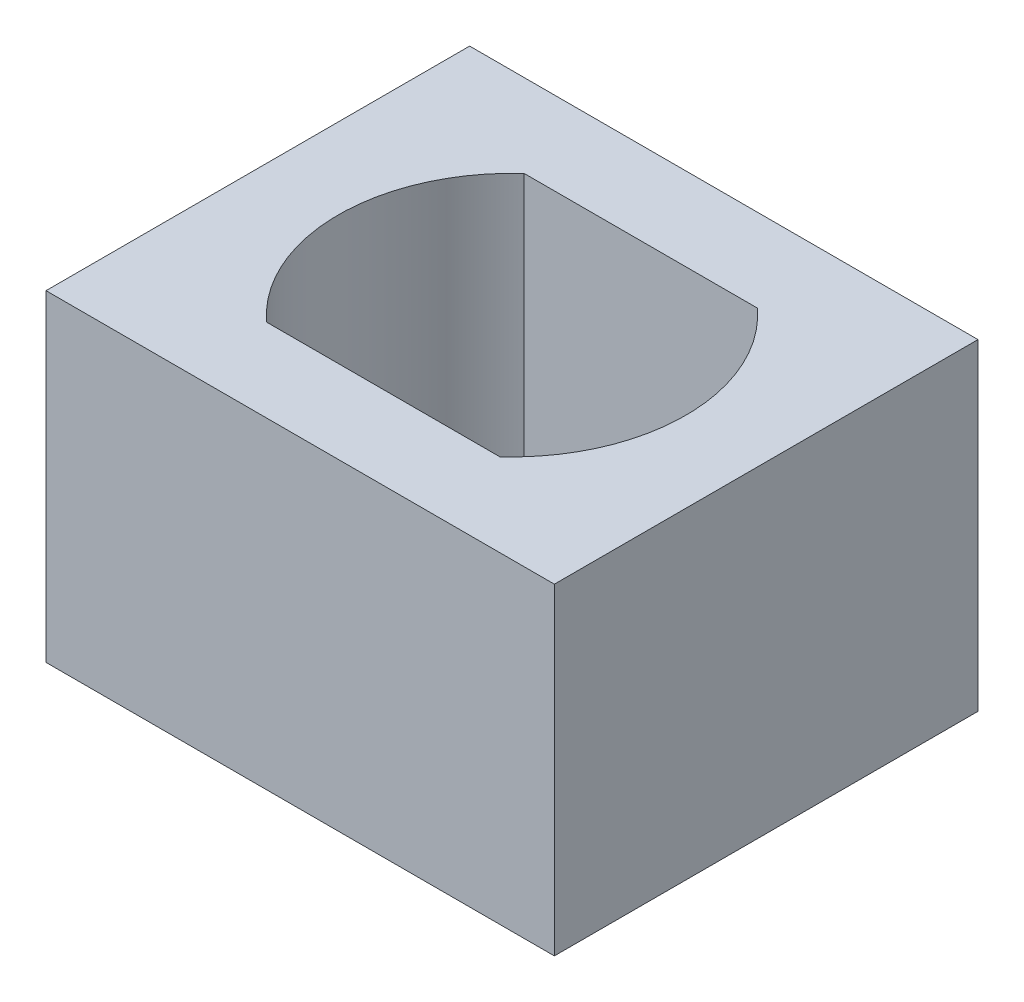
ISO-10303-21;
HEADER;
FILE_DESCRIPTION(('STEP AP214'),'2;1');
FILE_NAME('part.step','',(''),(''),'','','');
FILE_SCHEMA(('AUTOMOTIVE_DESIGN { 1 0 10303 214 1 1 1 1 }'));
ENDSEC;
DATA;
#1=APPLICATION_CONTEXT('core data for automotive mechanical design processes');
#2=APPLICATION_PROTOCOL_DEFINITION('international standard','automotive_design',2000,#1);
#3=PRODUCT_CONTEXT('',#1,'mechanical');
#4=PRODUCT('Part','Part','',(#3));
#5=PRODUCT_RELATED_PRODUCT_CATEGORY('part','',(#4));
#6=PRODUCT_DEFINITION_FORMATION('','',#4);
#7=PRODUCT_DEFINITION_CONTEXT('part definition',#1,'design');
#8=PRODUCT_DEFINITION('design','',#6,#7);
#9=PRODUCT_DEFINITION_SHAPE('','',#8);
#10=(LENGTH_UNIT() NAMED_UNIT(*) SI_UNIT(.MILLI.,.METRE.));
#11=(NAMED_UNIT(*) PLANE_ANGLE_UNIT() SI_UNIT($,.RADIAN.));
#12=(NAMED_UNIT(*) SI_UNIT($,.STERADIAN.) SOLID_ANGLE_UNIT());
#13=UNCERTAINTY_MEASURE_WITH_UNIT(LENGTH_MEASURE(1.E-05),#10,'distance_accuracy_value','');
#14=(GEOMETRIC_REPRESENTATION_CONTEXT(3) GLOBAL_UNCERTAINTY_ASSIGNED_CONTEXT((#13)) GLOBAL_UNIT_ASSIGNED_CONTEXT((#10,
#11,#12)) REPRESENTATION_CONTEXT('',''));
#15=CARTESIAN_POINT('',(0.,0.,0.));
#16=DIRECTION('',(0.,0.,1.));
#17=DIRECTION('',(1.,0.,0.));
#18=AXIS2_PLACEMENT_3D('',#15,#16,#17);
#19=CARTESIAN_POINT('',(0.,-12.5,25.));
#20=DIRECTION('',(0.,-1.,0.));
#21=DIRECTION('',(0.,0.,-1.));
#22=AXIS2_PLACEMENT_3D('',#19,#20,#21);
#23=PLANE('',#22);
#24=CARTESIAN_POINT('',(0.,-12.5,12.5));
#25=DIRECTION('',(0.,-1.,0.));
#26=DIRECTION('',(0.,0.,-1.));
#27=AXIS2_PLACEMENT_3D('',#24,#25,#26);
#28=CIRCLE('',#27,10.25);
#29=CARTESIAN_POINT('',(6.87768129532039,-12.5,4.9));
#30=VERTEX_POINT('',#29);
#31=CARTESIAN_POINT('',(6.87768129532039,-12.5,20.1));
#32=VERTEX_POINT('',#31);
#33=EDGE_CURVE('E163',#30,#32,#28,.T.);
#34=ORIENTED_EDGE('',*,*,#33,.F.);
#35=DIRECTION('',(1.,0.,0.));
#36=VECTOR('',#35,1.);
#37=CARTESIAN_POINT('',(0.,-12.5,4.9));
#38=LINE('',#37,#36);
#39=CARTESIAN_POINT('',(-6.87768129532039,-12.5,4.9));
#40=VERTEX_POINT('',#39);
#41=EDGE_CURVE('E69',#40,#30,#38,.T.);
#42=ORIENTED_EDGE('',*,*,#41,.F.);
#43=CARTESIAN_POINT('',(0.,-12.5,12.5));
#44=DIRECTION('',(0.,-1.,0.));
#45=DIRECTION('',(0.,0.,-1.));
#46=AXIS2_PLACEMENT_3D('',#43,#44,#45);
#47=CIRCLE('',#46,10.25);
#48=CARTESIAN_POINT('',(-6.87768129532039,-12.5,20.1));
#49=VERTEX_POINT('',#48);
#50=EDGE_CURVE('E173',#49,#40,#47,.T.);
#51=ORIENTED_EDGE('',*,*,#50,.F.);
#52=DIRECTION('',(-1.,0.,0.));
#53=VECTOR('',#52,1.);
#54=CARTESIAN_POINT('',(0.,-12.5,20.1));
#55=LINE('',#54,#53);
#56=EDGE_CURVE('E179',#32,#49,#55,.T.);
#57=ORIENTED_EDGE('',*,*,#56,.F.);
#58=EDGE_LOOP('',(#34,#42,#51,#57));
#59=FACE_BOUND('',#58,.T.);
#60=DIRECTION('',(-1.,0.,0.));
#61=VECTOR('',#60,1.);
#62=CARTESIAN_POINT('',(0.,-12.5,0.));
#63=LINE('',#62,#61);
#64=CARTESIAN_POINT('',(15.,-12.5,0.));
#65=VERTEX_POINT('',#64);
#66=CARTESIAN_POINT('',(-15.,-12.5,0.));
#67=VERTEX_POINT('',#66);
#68=EDGE_CURVE('E62',#65,#67,#63,.T.);
#69=ORIENTED_EDGE('',*,*,#68,.F.);
#70=DIRECTION('',(0.,0.,1.));
#71=VECTOR('',#70,1.);
#72=CARTESIAN_POINT('',(15.,-12.5,0.));
#73=LINE('',#72,#71);
#74=CARTESIAN_POINT('',(15.,-12.5,25.));
#75=VERTEX_POINT('',#74);
#76=EDGE_CURVE('E123',#65,#75,#73,.T.);
#77=ORIENTED_EDGE('',*,*,#76,.T.);
#78=DIRECTION('',(-1.,0.,0.));
#79=VECTOR('',#78,1.);
#80=CARTESIAN_POINT('',(0.,-12.5,25.));
#81=LINE('',#80,#79);
#82=CARTESIAN_POINT('',(-15.,-12.5,25.));
#83=VERTEX_POINT('',#82);
#84=EDGE_CURVE('E12',#75,#83,#81,.T.);
#85=ORIENTED_EDGE('',*,*,#84,.T.);
#86=DIRECTION('',(0.,0.,1.));
#87=VECTOR('',#86,1.);
#88=CARTESIAN_POINT('',(-15.,-12.5,0.));
#89=LINE('',#88,#87);
#90=EDGE_CURVE('E121',#67,#83,#89,.T.);
#91=ORIENTED_EDGE('',*,*,#90,.F.);
#92=EDGE_LOOP('',(#69,#77,#85,#91));
#93=FACE_BOUND('',#92,.T.);
#94=ADVANCED_FACE('F54',(#59,#93),#23,.T.);
#95=CARTESIAN_POINT('',(0.,0.,0.));
#96=DIRECTION('',(0.,0.,1.));
#97=DIRECTION('',(1.,0.,0.));
#98=AXIS2_PLACEMENT_3D('',#95,#96,#97);
#99=PLANE('',#98);
#100=DIRECTION('',(1.,0.,0.));
#101=VECTOR('',#100,1.);
#102=CARTESIAN_POINT('',(0.,6.5,0.));
#103=LINE('',#102,#101);
#104=CARTESIAN_POINT('',(-15.,6.5,0.));
#105=VERTEX_POINT('',#104);
#106=CARTESIAN_POINT('',(15.,6.5,0.));
#107=VERTEX_POINT('',#106);
#108=EDGE_CURVE('E182',#105,#107,#103,.T.);
#109=ORIENTED_EDGE('',*,*,#108,.T.);
#110=DIRECTION('',(0.,1.,0.));
#111=VECTOR('',#110,1.);
#112=CARTESIAN_POINT('',(15.,-12.5,0.));
#113=LINE('',#112,#111);
#114=EDGE_CURVE('E147',#65,#107,#113,.T.);
#115=ORIENTED_EDGE('',*,*,#114,.F.);
#116=ORIENTED_EDGE('',*,*,#68,.T.);
#117=DIRECTION('',(0.,1.,0.));
#118=VECTOR('',#117,1.);
#119=CARTESIAN_POINT('',(-15.,-12.5,0.));
#120=LINE('',#119,#118);
#121=EDGE_CURVE('E134',#67,#105,#120,.T.);
#122=ORIENTED_EDGE('',*,*,#121,.T.);
#123=EDGE_LOOP('',(#109,#115,#116,#122));
#124=FACE_BOUND('',#123,.T.);
#125=ADVANCED_FACE('F191',(#124),#99,.F.);
#126=CARTESIAN_POINT('',(0.,0.,25.));
#127=DIRECTION('',(0.,0.,1.));
#128=DIRECTION('',(1.,0.,0.));
#129=AXIS2_PLACEMENT_3D('',#126,#127,#128);
#130=PLANE('',#129);
#131=DIRECTION('',(1.,0.,0.));
#132=VECTOR('',#131,1.);
#133=CARTESIAN_POINT('',(0.,6.5,25.));
#134=LINE('',#133,#132);
#135=CARTESIAN_POINT('',(-15.,6.5,25.));
#136=VERTEX_POINT('',#135);
#137=CARTESIAN_POINT('',(15.,6.5,25.));
#138=VERTEX_POINT('',#137);
#139=EDGE_CURVE('E130',#136,#138,#134,.T.);
#140=ORIENTED_EDGE('',*,*,#139,.F.);
#141=DIRECTION('',(0.,1.,0.));
#142=VECTOR('',#141,1.);
#143=CARTESIAN_POINT('',(-15.,-12.5,25.));
#144=LINE('',#143,#142);
#145=EDGE_CURVE('E128',#83,#136,#144,.T.);
#146=ORIENTED_EDGE('',*,*,#145,.F.);
#147=ORIENTED_EDGE('',*,*,#84,.F.);
#148=DIRECTION('',(0.,1.,0.));
#149=VECTOR('',#148,1.);
#150=CARTESIAN_POINT('',(15.,-12.5,25.));
#151=LINE('',#150,#149);
#152=EDGE_CURVE('E141',#75,#138,#151,.T.);
#153=ORIENTED_EDGE('',*,*,#152,.T.);
#154=EDGE_LOOP('',(#140,#146,#147,#153));
#155=FACE_BOUND('',#154,.T.);
#156=ADVANCED_FACE('F129',(#155),#130,.T.);
#157=CARTESIAN_POINT('',(0.,6.5,0.));
#158=DIRECTION('',(0.,-1.,0.));
#159=DIRECTION('',(0.,0.,-1.));
#160=AXIS2_PLACEMENT_3D('',#157,#158,#159);
#161=PLANE('',#160);
#162=DIRECTION('',(-1.,0.,0.));
#163=VECTOR('',#162,1.);
#164=CARTESIAN_POINT('',(5.86515131944607,6.5,4.9));
#165=LINE('',#164,#163);
#166=CARTESIAN_POINT('',(6.87768129532039,6.5,4.9));
#167=VERTEX_POINT('',#166);
#168=CARTESIAN_POINT('',(-6.87768129532039,6.5,4.9));
#169=VERTEX_POINT('',#168);
#170=EDGE_CURVE('E177',#167,#169,#165,.T.);
#171=ORIENTED_EDGE('',*,*,#170,.F.);
#172=CARTESIAN_POINT('',(0.,6.5,12.5));
#173=DIRECTION('',(0.,1.,0.));
#174=DIRECTION('',(0.,0.,1.));
#175=AXIS2_PLACEMENT_3D('',#172,#173,#174);
#176=CIRCLE('',#175,10.25);
#177=CARTESIAN_POINT('',(6.87768129532039,6.5,20.1));
#178=VERTEX_POINT('',#177);
#179=EDGE_CURVE('E156',#178,#167,#176,.T.);
#180=ORIENTED_EDGE('',*,*,#179,.F.);
#181=DIRECTION('',(1.,0.,0.));
#182=VECTOR('',#181,1.);
#183=CARTESIAN_POINT('',(-5.86515131944608,6.5,20.1));
#184=LINE('',#183,#182);
#185=CARTESIAN_POINT('',(-6.87768129532039,6.5,20.1));
#186=VERTEX_POINT('',#185);
#187=EDGE_CURVE('E175',#186,#178,#184,.T.);
#188=ORIENTED_EDGE('',*,*,#187,.F.);
#189=CARTESIAN_POINT('',(0.,6.5,12.5));
#190=DIRECTION('',(0.,1.,0.));
#191=DIRECTION('',(0.,0.,1.));
#192=AXIS2_PLACEMENT_3D('',#189,#190,#191);
#193=CIRCLE('',#192,10.25);
#194=EDGE_CURVE('E144',#169,#186,#193,.T.);
#195=ORIENTED_EDGE('',*,*,#194,.F.);
#196=EDGE_LOOP('',(#171,#180,#188,#195));
#197=FACE_BOUND('',#196,.T.);
#198=ORIENTED_EDGE('',*,*,#139,.T.);
#199=DIRECTION('',(0.,0.,1.));
#200=VECTOR('',#199,1.);
#201=CARTESIAN_POINT('',(15.,6.5,0.));
#202=LINE('',#201,#200);
#203=EDGE_CURVE('E148',#107,#138,#202,.T.);
#204=ORIENTED_EDGE('',*,*,#203,.F.);
#205=ORIENTED_EDGE('',*,*,#108,.F.);
#206=DIRECTION('',(0.,0.,1.));
#207=VECTOR('',#206,1.);
#208=CARTESIAN_POINT('',(-15.,6.5,0.));
#209=LINE('',#208,#207);
#210=EDGE_CURVE('E139',#105,#136,#209,.T.);
#211=ORIENTED_EDGE('',*,*,#210,.T.);
#212=EDGE_LOOP('',(#198,#204,#205,#211));
#213=FACE_BOUND('',#212,.T.);
#214=ADVANCED_FACE('F196',(#197,#213),#161,.F.);
#215=CARTESIAN_POINT('',(5.86515131944607,-21.5,4.9));
#216=DIRECTION('',(0.,0.,-1.));
#217=DIRECTION('',(-1.,0.,0.));
#218=AXIS2_PLACEMENT_3D('',#215,#216,#217);
#219=PLANE('',#218);
#220=ORIENTED_EDGE('',*,*,#41,.T.);
#221=DIRECTION('',(0.,1.,0.));
#222=VECTOR('',#221,1.);
#223=CARTESIAN_POINT('',(6.87768129532039,-20.5,4.9));
#224=LINE('',#223,#222);
#225=EDGE_CURVE('E164',#30,#167,#224,.T.);
#226=ORIENTED_EDGE('',*,*,#225,.T.);
#227=ORIENTED_EDGE('',*,*,#170,.T.);
#228=DIRECTION('',(0.,1.,0.));
#229=VECTOR('',#228,1.);
#230=CARTESIAN_POINT('',(-6.87768129532039,-20.5,4.9));
#231=LINE('',#230,#229);
#232=EDGE_CURVE('E160',#40,#169,#231,.T.);
#233=ORIENTED_EDGE('',*,*,#232,.F.);
#234=EDGE_LOOP('',(#220,#226,#227,#233));
#235=FACE_BOUND('',#234,.T.);
#236=ADVANCED_FACE('F198',(#235),#219,.F.);
#237=CARTESIAN_POINT('',(-5.86515131944608,-21.5,20.1));
#238=DIRECTION('',(0.,0.,1.));
#239=DIRECTION('',(1.,0.,0.));
#240=AXIS2_PLACEMENT_3D('',#237,#238,#239);
#241=PLANE('',#240);
#242=ORIENTED_EDGE('',*,*,#56,.T.);
#243=DIRECTION('',(0.,1.,0.));
#244=VECTOR('',#243,1.);
#245=CARTESIAN_POINT('',(-6.87768129532039,-20.5,20.1));
#246=LINE('',#245,#244);
#247=EDGE_CURVE('E159',#49,#186,#246,.T.);
#248=ORIENTED_EDGE('',*,*,#247,.T.);
#249=ORIENTED_EDGE('',*,*,#187,.T.);
#250=DIRECTION('',(0.,1.,0.));
#251=VECTOR('',#250,1.);
#252=CARTESIAN_POINT('',(6.87768129532039,-20.5,20.1));
#253=LINE('',#252,#251);
#254=EDGE_CURVE('E166',#32,#178,#253,.T.);
#255=ORIENTED_EDGE('',*,*,#254,.F.);
#256=EDGE_LOOP('',(#242,#248,#249,#255));
#257=FACE_BOUND('',#256,.T.);
#258=ADVANCED_FACE('F206',(#257),#241,.F.);
#259=CARTESIAN_POINT('',(0.,-20.5,12.5));
#260=DIRECTION('',(0.,1.,0.));
#261=DIRECTION('',(0.,0.,1.));
#262=AXIS2_PLACEMENT_3D('',#259,#260,#261);
#263=CYLINDRICAL_SURFACE('',#262,10.25);
#264=ORIENTED_EDGE('',*,*,#33,.T.);
#265=ORIENTED_EDGE('',*,*,#254,.T.);
#266=ORIENTED_EDGE('',*,*,#179,.T.);
#267=ORIENTED_EDGE('',*,*,#225,.F.);
#268=EDGE_LOOP('',(#264,#265,#266,#267));
#269=FACE_BOUND('',#268,.T.);
#270=ADVANCED_FACE('F217',(#269),#263,.F.);
#271=CARTESIAN_POINT('',(0.,-20.5,12.5));
#272=DIRECTION('',(0.,1.,0.));
#273=DIRECTION('',(0.,0.,1.));
#274=AXIS2_PLACEMENT_3D('',#271,#272,#273);
#275=CYLINDRICAL_SURFACE('',#274,10.25);
#276=ORIENTED_EDGE('',*,*,#50,.T.);
#277=ORIENTED_EDGE('',*,*,#232,.T.);
#278=ORIENTED_EDGE('',*,*,#194,.T.);
#279=ORIENTED_EDGE('',*,*,#247,.F.);
#280=EDGE_LOOP('',(#276,#277,#278,#279));
#281=FACE_BOUND('',#280,.T.);
#282=ADVANCED_FACE('F223',(#281),#275,.F.);
#283=CARTESIAN_POINT('',(15.,-12.5,0.));
#284=DIRECTION('',(-1.,0.,0.));
#285=DIRECTION('',(0.,0.,1.));
#286=AXIS2_PLACEMENT_3D('',#283,#284,#285);
#287=PLANE('',#286);
#288=ORIENTED_EDGE('',*,*,#203,.T.);
#289=ORIENTED_EDGE('',*,*,#152,.F.);
#290=ORIENTED_EDGE('',*,*,#76,.F.);
#291=ORIENTED_EDGE('',*,*,#114,.T.);
#292=EDGE_LOOP('',(#288,#289,#290,#291));
#293=FACE_BOUND('',#292,.T.);
#294=ADVANCED_FACE('F194',(#293),#287,.F.);
#295=CARTESIAN_POINT('',(-15.,-12.5,0.));
#296=DIRECTION('',(-1.,0.,0.));
#297=DIRECTION('',(0.,0.,1.));
#298=AXIS2_PLACEMENT_3D('',#295,#296,#297);
#299=PLANE('',#298);
#300=ORIENTED_EDGE('',*,*,#210,.F.);
#301=ORIENTED_EDGE('',*,*,#121,.F.);
#302=ORIENTED_EDGE('',*,*,#90,.T.);
#303=ORIENTED_EDGE('',*,*,#145,.T.);
#304=EDGE_LOOP('',(#300,#301,#302,#303));
#305=FACE_BOUND('',#304,.T.);
#306=ADVANCED_FACE('F137',(#305),#299,.T.);
#307=CLOSED_SHELL('',(#94,#125,#156,#214,#236,#258,#270,#282,#294,#306));
#308=MANIFOLD_SOLID_BREP('B2',#307);
#309=ADVANCED_BREP_SHAPE_REPRESENTATION('',(#18,#308),#14);
#310=SHAPE_DEFINITION_REPRESENTATION(#9,#309);
ENDSEC;
END-ISO-10303-21;
